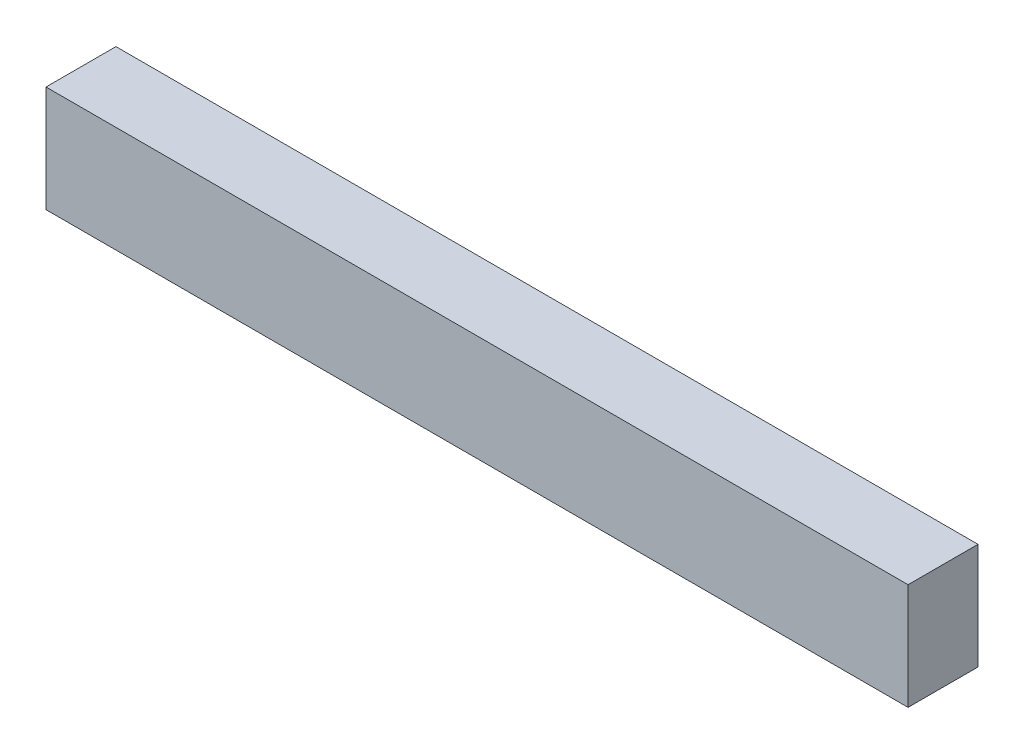
ISO-10303-21;
HEADER;
FILE_DESCRIPTION(('STEP AP214'),'2;1');
FILE_NAME('part.step','',(''),(''),'','','');
FILE_SCHEMA(('AUTOMOTIVE_DESIGN { 1 0 10303 214 1 1 1 1 }'));
ENDSEC;
DATA;
#1=APPLICATION_CONTEXT('core data for automotive mechanical design processes');
#2=APPLICATION_PROTOCOL_DEFINITION('international standard','automotive_design',2000,#1);
#3=PRODUCT_CONTEXT('',#1,'mechanical');
#4=PRODUCT('Part','Part','',(#3));
#5=PRODUCT_RELATED_PRODUCT_CATEGORY('part','',(#4));
#6=PRODUCT_DEFINITION_FORMATION('','',#4);
#7=PRODUCT_DEFINITION_CONTEXT('part definition',#1,'design');
#8=PRODUCT_DEFINITION('design','',#6,#7);
#9=PRODUCT_DEFINITION_SHAPE('','',#8);
#10=(LENGTH_UNIT() NAMED_UNIT(*) SI_UNIT(.MILLI.,.METRE.));
#11=(NAMED_UNIT(*) PLANE_ANGLE_UNIT() SI_UNIT($,.RADIAN.));
#12=(NAMED_UNIT(*) SI_UNIT($,.STERADIAN.) SOLID_ANGLE_UNIT());
#13=UNCERTAINTY_MEASURE_WITH_UNIT(LENGTH_MEASURE(1.E-05),#10,'distance_accuracy_value','');
#14=(GEOMETRIC_REPRESENTATION_CONTEXT(3) GLOBAL_UNCERTAINTY_ASSIGNED_CONTEXT((#13)) GLOBAL_UNIT_ASSIGNED_CONTEXT((#10,
#11,#12)) REPRESENTATION_CONTEXT('',''));
#15=CARTESIAN_POINT('',(0.,0.,0.));
#16=DIRECTION('',(0.,0.,1.));
#17=DIRECTION('',(1.,0.,0.));
#18=AXIS2_PLACEMENT_3D('',#15,#16,#17);
#19=CARTESIAN_POINT('',(0.,0.,32.));
#20=DIRECTION('',(0.,0.,-1.));
#21=DIRECTION('',(-1.,0.,0.));
#22=AXIS2_PLACEMENT_3D('',#19,#20,#21);
#23=PLANE('',#22);
#24=DIRECTION('',(0.,1.,0.));
#25=VECTOR('',#24,1.);
#26=CARTESIAN_POINT('',(240.6,25.217302294943,32.));
#27=LINE('',#26,#25);
#28=CARTESIAN_POINT('',(240.6,19.1407400337098,32.));
#29=VERTEX_POINT('',#28);
#30=CARTESIAN_POINT('',(240.6,25.217302294943,32.));
#31=VERTEX_POINT('',#30);
#32=EDGE_CURVE('E81',#29,#31,#27,.T.);
#33=ORIENTED_EDGE('',*,*,#32,.T.);
#34=DIRECTION('',(-1.,0.,0.));
#35=VECTOR('',#34,1.);
#36=CARTESIAN_POINT('',(240.6,25.217302294943,32.));
#37=LINE('',#36,#35);
#38=CARTESIAN_POINT('',(191.3,25.217302294943,32.));
#39=VERTEX_POINT('',#38);
#40=EDGE_CURVE('E75',#31,#39,#37,.T.);
#41=ORIENTED_EDGE('',*,*,#40,.T.);
#42=DIRECTION('',(0.,-1.,0.));
#43=VECTOR('',#42,1.);
#44=CARTESIAN_POINT('',(191.3,25.217302294943,32.));
#45=LINE('',#44,#43);
#46=CARTESIAN_POINT('',(191.3,19.1407400337098,32.));
#47=VERTEX_POINT('',#46);
#48=EDGE_CURVE('E78',#39,#47,#45,.T.);
#49=ORIENTED_EDGE('',*,*,#48,.T.);
#50=DIRECTION('',(1.,0.,0.));
#51=VECTOR('',#50,1.);
#52=CARTESIAN_POINT('',(240.6,19.1407400337098,32.));
#53=LINE('',#52,#51);
#54=EDGE_CURVE('E57',#47,#29,#53,.T.);
#55=ORIENTED_EDGE('',*,*,#54,.T.);
#56=EDGE_LOOP('',(#33,#41,#49,#55));
#57=FACE_BOUND('',#56,.T.);
#58=ADVANCED_FACE('F33',(#57),#23,.F.);
#59=CARTESIAN_POINT('',(240.6,25.217302294943,32.));
#60=DIRECTION('',(0.,-1.,0.));
#61=DIRECTION('',(1.,0.,0.));
#62=AXIS2_PLACEMENT_3D('',#59,#60,#61);
#63=PLANE('',#62);
#64=DIRECTION('',(0.,0.,-1.));
#65=VECTOR('',#64,1.);
#66=CARTESIAN_POINT('',(240.6,25.217302294943,32.));
#67=LINE('',#66,#65);
#68=CARTESIAN_POINT('',(240.6,25.217302294943,28.));
#69=VERTEX_POINT('',#68);
#70=EDGE_CURVE('E41',#31,#69,#67,.T.);
#71=ORIENTED_EDGE('',*,*,#70,.T.);
#72=DIRECTION('',(1.,0.,0.));
#73=VECTOR('',#72,1.);
#74=CARTESIAN_POINT('',(191.3,25.217302294943,28.));
#75=LINE('',#74,#73);
#76=CARTESIAN_POINT('',(191.3,25.217302294943,28.));
#77=VERTEX_POINT('',#76);
#78=EDGE_CURVE('E11',#77,#69,#75,.T.);
#79=ORIENTED_EDGE('',*,*,#78,.F.);
#80=DIRECTION('',(0.,0.,-1.));
#81=VECTOR('',#80,1.);
#82=CARTESIAN_POINT('',(191.3,25.217302294943,32.));
#83=LINE('',#82,#81);
#84=EDGE_CURVE('E87',#39,#77,#83,.T.);
#85=ORIENTED_EDGE('',*,*,#84,.F.);
#86=ORIENTED_EDGE('',*,*,#40,.F.);
#87=EDGE_LOOP('',(#71,#79,#85,#86));
#88=FACE_BOUND('',#87,.T.);
#89=ADVANCED_FACE('F88',(#88),#63,.F.);
#90=CARTESIAN_POINT('',(240.6,19.1407400337098,32.));
#91=DIRECTION('',(0.,1.,0.));
#92=DIRECTION('',(-1.,0.,0.));
#93=AXIS2_PLACEMENT_3D('',#90,#91,#92);
#94=PLANE('',#93);
#95=DIRECTION('',(0.,0.,-1.));
#96=VECTOR('',#95,1.);
#97=CARTESIAN_POINT('',(191.3,19.1407400337098,32.));
#98=LINE('',#97,#96);
#99=CARTESIAN_POINT('',(191.3,19.1407400337098,28.));
#100=VERTEX_POINT('',#99);
#101=EDGE_CURVE('E90',#47,#100,#98,.T.);
#102=ORIENTED_EDGE('',*,*,#101,.T.);
#103=DIRECTION('',(1.,0.,0.));
#104=VECTOR('',#103,1.);
#105=CARTESIAN_POINT('',(240.6,19.1407400337098,28.));
#106=LINE('',#105,#104);
#107=CARTESIAN_POINT('',(240.6,19.1407400337098,28.));
#108=VERTEX_POINT('',#107);
#109=EDGE_CURVE('E48',#100,#108,#106,.T.);
#110=ORIENTED_EDGE('',*,*,#109,.T.);
#111=DIRECTION('',(0.,0.,-1.));
#112=VECTOR('',#111,1.);
#113=CARTESIAN_POINT('',(240.6,19.1407400337098,32.));
#114=LINE('',#113,#112);
#115=EDGE_CURVE('E93',#29,#108,#114,.T.);
#116=ORIENTED_EDGE('',*,*,#115,.F.);
#117=ORIENTED_EDGE('',*,*,#54,.F.);
#118=EDGE_LOOP('',(#102,#110,#116,#117));
#119=FACE_BOUND('',#118,.T.);
#120=ADVANCED_FACE('F113',(#119),#94,.F.);
#121=CARTESIAN_POINT('',(240.6,13.0641777724765,18.0000000000002));
#122=DIRECTION('',(1.,0.,0.));
#123=DIRECTION('',(0.,0.,-1.));
#124=AXIS2_PLACEMENT_3D('',#121,#122,#123);
#125=PLANE('',#124);
#126=DIRECTION('',(0.,1.,0.));
#127=VECTOR('',#126,1.);
#128=CARTESIAN_POINT('',(240.6,19.1407400337098,28.));
#129=LINE('',#128,#127);
#130=EDGE_CURVE('E103',#108,#69,#129,.T.);
#131=ORIENTED_EDGE('',*,*,#130,.T.);
#132=ORIENTED_EDGE('',*,*,#70,.F.);
#133=ORIENTED_EDGE('',*,*,#32,.F.);
#134=ORIENTED_EDGE('',*,*,#115,.T.);
#135=EDGE_LOOP('',(#131,#132,#133,#134));
#136=FACE_BOUND('',#135,.T.);
#137=ADVANCED_FACE('F102',(#136),#125,.T.);
#138=CARTESIAN_POINT('',(0.,0.,28.));
#139=DIRECTION('',(0.,0.,-1.));
#140=DIRECTION('',(-1.,0.,0.));
#141=AXIS2_PLACEMENT_3D('',#138,#139,#140);
#142=PLANE('',#141);
#143=ORIENTED_EDGE('',*,*,#109,.F.);
#144=DIRECTION('',(0.,-1.,0.));
#145=VECTOR('',#144,1.);
#146=CARTESIAN_POINT('',(191.3,25.217302294943,28.));
#147=LINE('',#146,#145);
#148=EDGE_CURVE('E71',#77,#100,#147,.T.);
#149=ORIENTED_EDGE('',*,*,#148,.F.);
#150=ORIENTED_EDGE('',*,*,#78,.T.);
#151=ORIENTED_EDGE('',*,*,#130,.F.);
#152=EDGE_LOOP('',(#143,#149,#150,#151));
#153=FACE_BOUND('',#152,.T.);
#154=ADVANCED_FACE('F106',(#153),#142,.T.);
#155=CARTESIAN_POINT('',(191.3,13.0641777724765,18.0000000000002));
#156=DIRECTION('',(-1.,0.,0.));
#157=DIRECTION('',(0.,-1.,0.));
#158=AXIS2_PLACEMENT_3D('',#155,#156,#157);
#159=PLANE('',#158);
#160=ORIENTED_EDGE('',*,*,#148,.T.);
#161=ORIENTED_EDGE('',*,*,#101,.F.);
#162=ORIENTED_EDGE('',*,*,#48,.F.);
#163=ORIENTED_EDGE('',*,*,#84,.T.);
#164=EDGE_LOOP('',(#160,#161,#162,#163));
#165=FACE_BOUND('',#164,.T.);
#166=ADVANCED_FACE('F35',(#165),#159,.T.);
#167=CLOSED_SHELL('',(#58,#89,#120,#137,#154,#166));
#168=MANIFOLD_SOLID_BREP('B2',#167);
#169=ADVANCED_BREP_SHAPE_REPRESENTATION('',(#18,#168),#14);
#170=SHAPE_DEFINITION_REPRESENTATION(#9,#169);
ENDSEC;
END-ISO-10303-21;
